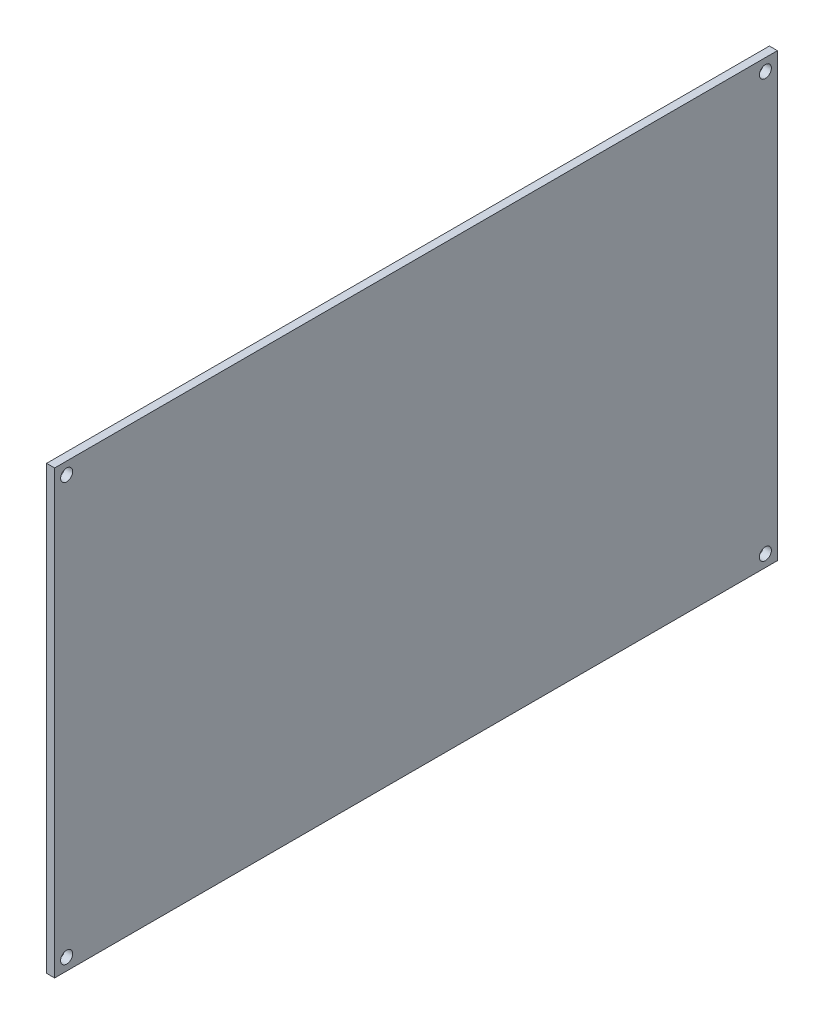
ISO-10303-21;
HEADER;
FILE_DESCRIPTION(('STEP AP214'),'2;1');
FILE_NAME('part.step','',(''),(''),'','','');
FILE_SCHEMA(('AUTOMOTIVE_DESIGN { 1 0 10303 214 1 1 1 1 }'));
ENDSEC;
DATA;
#1=APPLICATION_CONTEXT('core data for automotive mechanical design processes');
#2=APPLICATION_PROTOCOL_DEFINITION('international standard','automotive_design',2000,#1);
#3=PRODUCT_CONTEXT('',#1,'mechanical');
#4=PRODUCT('Part','Part','',(#3));
#5=PRODUCT_RELATED_PRODUCT_CATEGORY('part','',(#4));
#6=PRODUCT_DEFINITION_FORMATION('','',#4);
#7=PRODUCT_DEFINITION_CONTEXT('part definition',#1,'design');
#8=PRODUCT_DEFINITION('design','',#6,#7);
#9=PRODUCT_DEFINITION_SHAPE('','',#8);
#10=(LENGTH_UNIT() NAMED_UNIT(*) SI_UNIT(.MILLI.,.METRE.));
#11=(NAMED_UNIT(*) PLANE_ANGLE_UNIT() SI_UNIT($,.RADIAN.));
#12=(NAMED_UNIT(*) SI_UNIT($,.STERADIAN.) SOLID_ANGLE_UNIT());
#13=UNCERTAINTY_MEASURE_WITH_UNIT(LENGTH_MEASURE(1.E-05),#10,'distance_accuracy_value','');
#14=(GEOMETRIC_REPRESENTATION_CONTEXT(3) GLOBAL_UNCERTAINTY_ASSIGNED_CONTEXT((#13)) GLOBAL_UNIT_ASSIGNED_CONTEXT((#10,
#11,#12)) REPRESENTATION_CONTEXT('',''));
#15=CARTESIAN_POINT('',(0.,0.,0.));
#16=DIRECTION('',(0.,0.,1.));
#17=DIRECTION('',(1.,0.,0.));
#18=AXIS2_PLACEMENT_3D('',#15,#16,#17);
#19=CARTESIAN_POINT('',(2.,0.,0.));
#20=DIRECTION('',(0.,0.,-1.));
#21=DIRECTION('',(-1.,0.,0.));
#22=AXIS2_PLACEMENT_3D('',#19,#20,#21);
#23=PLANE('',#22);
#24=DIRECTION('',(0.,-1.,0.));
#25=VECTOR('',#24,1.);
#26=CARTESIAN_POINT('',(0.,0.,0.));
#27=LINE('',#26,#25);
#28=CARTESIAN_POINT('',(0.,110.,0.));
#29=VERTEX_POINT('',#28);
#30=CARTESIAN_POINT('',(0.,0.,0.));
#31=VERTEX_POINT('',#30);
#32=EDGE_CURVE('E99',#29,#31,#27,.T.);
#33=ORIENTED_EDGE('',*,*,#32,.T.);
#34=DIRECTION('',(-1.,0.,0.));
#35=VECTOR('',#34,1.);
#36=CARTESIAN_POINT('',(2.,0.,0.));
#37=LINE('',#36,#35);
#38=CARTESIAN_POINT('',(2.,0.,0.));
#39=VERTEX_POINT('',#38);
#40=EDGE_CURVE('E11',#39,#31,#37,.T.);
#41=ORIENTED_EDGE('',*,*,#40,.F.);
#42=DIRECTION('',(0.,-1.,0.));
#43=VECTOR('',#42,1.);
#44=CARTESIAN_POINT('',(2.,0.,0.));
#45=LINE('',#44,#43);
#46=CARTESIAN_POINT('',(2.,110.,0.));
#47=VERTEX_POINT('',#46);
#48=EDGE_CURVE('E86',#47,#39,#45,.T.);
#49=ORIENTED_EDGE('',*,*,#48,.F.);
#50=DIRECTION('',(-1.,0.,0.));
#51=VECTOR('',#50,1.);
#52=CARTESIAN_POINT('',(2.,110.,0.));
#53=LINE('',#52,#51);
#54=EDGE_CURVE('E95',#47,#29,#53,.T.);
#55=ORIENTED_EDGE('',*,*,#54,.T.);
#56=EDGE_LOOP('',(#33,#41,#49,#55));
#57=FACE_BOUND('',#56,.T.);
#58=ADVANCED_FACE('F33',(#57),#23,.F.);
#59=CARTESIAN_POINT('',(2.,0.,0.));
#60=DIRECTION('',(0.,1.,0.));
#61=DIRECTION('',(0.,0.,1.));
#62=AXIS2_PLACEMENT_3D('',#59,#60,#61);
#63=PLANE('',#62);
#64=DIRECTION('',(0.,0.,-1.));
#65=VECTOR('',#64,1.);
#66=CARTESIAN_POINT('',(0.,0.,0.));
#67=LINE('',#66,#65);
#68=CARTESIAN_POINT('',(0.,0.,-180.));
#69=VERTEX_POINT('',#68);
#70=EDGE_CURVE('E90',#31,#69,#67,.T.);
#71=ORIENTED_EDGE('',*,*,#70,.T.);
#72=DIRECTION('',(-1.,0.,0.));
#73=VECTOR('',#72,1.);
#74=CARTESIAN_POINT('',(2.,0.,-180.));
#75=LINE('',#74,#73);
#76=CARTESIAN_POINT('',(2.,0.,-180.));
#77=VERTEX_POINT('',#76);
#78=EDGE_CURVE('E42',#77,#69,#75,.T.);
#79=ORIENTED_EDGE('',*,*,#78,.F.);
#80=DIRECTION('',(0.,0.,-1.));
#81=VECTOR('',#80,1.);
#82=CARTESIAN_POINT('',(2.,0.,0.));
#83=LINE('',#82,#81);
#84=EDGE_CURVE('E81',#39,#77,#83,.T.);
#85=ORIENTED_EDGE('',*,*,#84,.F.);
#86=ORIENTED_EDGE('',*,*,#40,.T.);
#87=EDGE_LOOP('',(#71,#79,#85,#86));
#88=FACE_BOUND('',#87,.T.);
#89=ADVANCED_FACE('F89',(#88),#63,.F.);
#90=CARTESIAN_POINT('',(2.,0.,-180.));
#91=DIRECTION('',(0.,0.,1.));
#92=DIRECTION('',(1.,0.,0.));
#93=AXIS2_PLACEMENT_3D('',#90,#91,#92);
#94=PLANE('',#93);
#95=DIRECTION('',(0.,1.,0.));
#96=VECTOR('',#95,1.);
#97=CARTESIAN_POINT('',(0.,0.,-180.));
#98=LINE('',#97,#96);
#99=CARTESIAN_POINT('',(0.,110.,-180.));
#100=VERTEX_POINT('',#99);
#101=EDGE_CURVE('E68',#69,#100,#98,.T.);
#102=ORIENTED_EDGE('',*,*,#101,.T.);
#103=DIRECTION('',(-1.,0.,0.));
#104=VECTOR('',#103,1.);
#105=CARTESIAN_POINT('',(2.,110.,-180.));
#106=LINE('',#105,#104);
#107=CARTESIAN_POINT('',(2.,110.,-180.));
#108=VERTEX_POINT('',#107);
#109=EDGE_CURVE('E91',#108,#100,#106,.T.);
#110=ORIENTED_EDGE('',*,*,#109,.F.);
#111=DIRECTION('',(0.,1.,0.));
#112=VECTOR('',#111,1.);
#113=CARTESIAN_POINT('',(2.,0.,-180.));
#114=LINE('',#113,#112);
#115=EDGE_CURVE('E84',#77,#108,#114,.T.);
#116=ORIENTED_EDGE('',*,*,#115,.F.);
#117=ORIENTED_EDGE('',*,*,#78,.T.);
#118=EDGE_LOOP('',(#102,#110,#116,#117));
#119=FACE_BOUND('',#118,.T.);
#120=ADVANCED_FACE('F93',(#119),#94,.F.);
#121=CARTESIAN_POINT('',(2.,110.,0.));
#122=DIRECTION('',(0.,-1.,0.));
#123=DIRECTION('',(0.,0.,-1.));
#124=AXIS2_PLACEMENT_3D('',#121,#122,#123);
#125=PLANE('',#124);
#126=DIRECTION('',(0.,0.,1.));
#127=VECTOR('',#126,1.);
#128=CARTESIAN_POINT('',(0.,110.,0.));
#129=LINE('',#128,#127);
#130=EDGE_CURVE('E74',#100,#29,#129,.T.);
#131=ORIENTED_EDGE('',*,*,#130,.T.);
#132=ORIENTED_EDGE('',*,*,#54,.F.);
#133=DIRECTION('',(0.,0.,1.));
#134=VECTOR('',#133,1.);
#135=CARTESIAN_POINT('',(2.,110.,0.));
#136=LINE('',#135,#134);
#137=EDGE_CURVE('E51',#108,#47,#136,.T.);
#138=ORIENTED_EDGE('',*,*,#137,.F.);
#139=ORIENTED_EDGE('',*,*,#109,.T.);
#140=EDGE_LOOP('',(#131,#132,#138,#139));
#141=FACE_BOUND('',#140,.T.);
#142=ADVANCED_FACE('F140',(#141),#125,.F.);
#143=CARTESIAN_POINT('',(2.,0.,0.));
#144=DIRECTION('',(-1.,0.,0.));
#145=DIRECTION('',(0.,0.,1.));
#146=AXIS2_PLACEMENT_3D('',#143,#144,#145);
#147=PLANE('',#146);
#148=CARTESIAN_POINT('',(2.,107.,-177.));
#149=DIRECTION('',(1.,0.,0.));
#150=DIRECTION('',(0.,0.,-1.));
#151=AXIS2_PLACEMENT_3D('',#148,#149,#150);
#152=CIRCLE('',#151,1.5);
#153=CARTESIAN_POINT('',(2.,107.,-178.5));
#154=VERTEX_POINT('',#153);
#155=EDGE_CURVE('E114',#154,#154,#152,.T.);
#156=ORIENTED_EDGE('',*,*,#155,.F.);
#157=EDGE_LOOP('',(#156));
#158=FACE_BOUND('',#157,.T.);
#159=CARTESIAN_POINT('',(2.,3.,-177.));
#160=DIRECTION('',(1.,0.,0.));
#161=DIRECTION('',(0.,0.,-1.));
#162=AXIS2_PLACEMENT_3D('',#159,#160,#161);
#163=CIRCLE('',#162,1.5);
#164=CARTESIAN_POINT('',(2.,3.,-178.5));
#165=VERTEX_POINT('',#164);
#166=EDGE_CURVE('E129',#165,#165,#163,.T.);
#167=ORIENTED_EDGE('',*,*,#166,.F.);
#168=EDGE_LOOP('',(#167));
#169=FACE_BOUND('',#168,.T.);
#170=CARTESIAN_POINT('',(2.,3.,-3.));
#171=DIRECTION('',(1.,0.,0.));
#172=DIRECTION('',(0.,0.,-1.));
#173=AXIS2_PLACEMENT_3D('',#170,#171,#172);
#174=CIRCLE('',#173,1.5);
#175=CARTESIAN_POINT('',(2.,3.,-4.5));
#176=VERTEX_POINT('',#175);
#177=EDGE_CURVE('E126',#176,#176,#174,.T.);
#178=ORIENTED_EDGE('',*,*,#177,.F.);
#179=EDGE_LOOP('',(#178));
#180=FACE_BOUND('',#179,.T.);
#181=CARTESIAN_POINT('',(2.,107.,-3.));
#182=DIRECTION('',(1.,0.,0.));
#183=DIRECTION('',(0.,0.,-1.));
#184=AXIS2_PLACEMENT_3D('',#181,#182,#183);
#185=CIRCLE('',#184,1.5);
#186=CARTESIAN_POINT('',(2.,107.,-4.5));
#187=VERTEX_POINT('',#186);
#188=EDGE_CURVE('E110',#187,#187,#185,.T.);
#189=ORIENTED_EDGE('',*,*,#188,.F.);
#190=EDGE_LOOP('',(#189));
#191=FACE_BOUND('',#190,.T.);
#192=ORIENTED_EDGE('',*,*,#48,.T.);
#193=ORIENTED_EDGE('',*,*,#84,.T.);
#194=ORIENTED_EDGE('',*,*,#115,.T.);
#195=ORIENTED_EDGE('',*,*,#137,.T.);
#196=EDGE_LOOP('',(#192,#193,#194,#195));
#197=FACE_BOUND('',#196,.T.);
#198=ADVANCED_FACE('F82',(#158,#169,#180,#191,#197),#147,.F.);
#199=CARTESIAN_POINT('',(0.,0.,0.));
#200=DIRECTION('',(-1.,0.,0.));
#201=DIRECTION('',(0.,0.,1.));
#202=AXIS2_PLACEMENT_3D('',#199,#200,#201);
#203=PLANE('',#202);
#204=CARTESIAN_POINT('',(0.,107.,-177.));
#205=DIRECTION('',(-1.,0.,0.));
#206=DIRECTION('',(0.,0.,1.));
#207=AXIS2_PLACEMENT_3D('',#204,#205,#206);
#208=CIRCLE('',#207,1.5);
#209=CARTESIAN_POINT('',(0.,107.,-175.5));
#210=VERTEX_POINT('',#209);
#211=EDGE_CURVE('E36',#210,#210,#208,.T.);
#212=ORIENTED_EDGE('',*,*,#211,.F.);
#213=EDGE_LOOP('',(#212));
#214=FACE_BOUND('',#213,.T.);
#215=CARTESIAN_POINT('',(0.,3.,-177.));
#216=DIRECTION('',(-1.,0.,0.));
#217=DIRECTION('',(0.,0.,1.));
#218=AXIS2_PLACEMENT_3D('',#215,#216,#217);
#219=CIRCLE('',#218,1.5);
#220=CARTESIAN_POINT('',(0.,3.,-175.5));
#221=VERTEX_POINT('',#220);
#222=EDGE_CURVE('E113',#221,#221,#219,.T.);
#223=ORIENTED_EDGE('',*,*,#222,.F.);
#224=EDGE_LOOP('',(#223));
#225=FACE_BOUND('',#224,.T.);
#226=CARTESIAN_POINT('',(0.,3.,-3.));
#227=DIRECTION('',(-1.,0.,0.));
#228=DIRECTION('',(0.,0.,1.));
#229=AXIS2_PLACEMENT_3D('',#226,#227,#228);
#230=CIRCLE('',#229,1.5);
#231=CARTESIAN_POINT('',(0.,3.,-1.5));
#232=VERTEX_POINT('',#231);
#233=EDGE_CURVE('E111',#232,#232,#230,.T.);
#234=ORIENTED_EDGE('',*,*,#233,.F.);
#235=EDGE_LOOP('',(#234));
#236=FACE_BOUND('',#235,.T.);
#237=CARTESIAN_POINT('',(0.,107.,-3.));
#238=DIRECTION('',(-1.,0.,0.));
#239=DIRECTION('',(0.,0.,1.));
#240=AXIS2_PLACEMENT_3D('',#237,#238,#239);
#241=CIRCLE('',#240,1.5);
#242=CARTESIAN_POINT('',(0.,107.,-1.5));
#243=VERTEX_POINT('',#242);
#244=EDGE_CURVE('E102',#243,#243,#241,.T.);
#245=ORIENTED_EDGE('',*,*,#244,.F.);
#246=EDGE_LOOP('',(#245));
#247=FACE_BOUND('',#246,.T.);
#248=ORIENTED_EDGE('',*,*,#32,.F.);
#249=ORIENTED_EDGE('',*,*,#130,.F.);
#250=ORIENTED_EDGE('',*,*,#101,.F.);
#251=ORIENTED_EDGE('',*,*,#70,.F.);
#252=EDGE_LOOP('',(#248,#249,#250,#251));
#253=FACE_BOUND('',#252,.T.);
#254=ADVANCED_FACE('F139',(#214,#225,#236,#247,#253),#203,.T.);
#255=CARTESIAN_POINT('',(-1.,107.,-3.));
#256=DIRECTION('',(1.,0.,0.));
#257=DIRECTION('',(0.,0.,-1.));
#258=AXIS2_PLACEMENT_3D('',#255,#256,#257);
#259=CYLINDRICAL_SURFACE('',#258,1.5);
#260=ORIENTED_EDGE('',*,*,#244,.T.);
#261=EDGE_LOOP('',(#260));
#262=FACE_BOUND('',#261,.T.);
#263=ORIENTED_EDGE('',*,*,#188,.T.);
#264=EDGE_LOOP('',(#263));
#265=FACE_BOUND('',#264,.T.);
#266=ADVANCED_FACE('F150',(#262,#265),#259,.F.);
#267=CARTESIAN_POINT('',(-1.,3.,-3.));
#268=DIRECTION('',(1.,0.,0.));
#269=DIRECTION('',(0.,0.,-1.));
#270=AXIS2_PLACEMENT_3D('',#267,#268,#269);
#271=CYLINDRICAL_SURFACE('',#270,1.5);
#272=ORIENTED_EDGE('',*,*,#233,.T.);
#273=EDGE_LOOP('',(#272));
#274=FACE_BOUND('',#273,.T.);
#275=ORIENTED_EDGE('',*,*,#177,.T.);
#276=EDGE_LOOP('',(#275));
#277=FACE_BOUND('',#276,.T.);
#278=ADVANCED_FACE('F147',(#274,#277),#271,.F.);
#279=CARTESIAN_POINT('',(-1.,3.,-177.));
#280=DIRECTION('',(1.,0.,0.));
#281=DIRECTION('',(0.,0.,-1.));
#282=AXIS2_PLACEMENT_3D('',#279,#280,#281);
#283=CYLINDRICAL_SURFACE('',#282,1.5);
#284=ORIENTED_EDGE('',*,*,#222,.T.);
#285=EDGE_LOOP('',(#284));
#286=FACE_BOUND('',#285,.T.);
#287=ORIENTED_EDGE('',*,*,#166,.T.);
#288=EDGE_LOOP('',(#287));
#289=FACE_BOUND('',#288,.T.);
#290=ADVANCED_FACE('F149',(#286,#289),#283,.F.);
#291=CARTESIAN_POINT('',(-1.,107.,-177.));
#292=DIRECTION('',(1.,0.,0.));
#293=DIRECTION('',(0.,0.,-1.));
#294=AXIS2_PLACEMENT_3D('',#291,#292,#293);
#295=CYLINDRICAL_SURFACE('',#294,1.5);
#296=ORIENTED_EDGE('',*,*,#211,.T.);
#297=EDGE_LOOP('',(#296));
#298=FACE_BOUND('',#297,.T.);
#299=ORIENTED_EDGE('',*,*,#155,.T.);
#300=EDGE_LOOP('',(#299));
#301=FACE_BOUND('',#300,.T.);
#302=ADVANCED_FACE('F135',(#298,#301),#295,.F.);
#303=CLOSED_SHELL('',(#58,#89,#120,#142,#198,#254,#266,#278,#290,#302));
#304=MANIFOLD_SOLID_BREP('B2',#303);
#305=ADVANCED_BREP_SHAPE_REPRESENTATION('',(#18,#304),#14);
#306=SHAPE_DEFINITION_REPRESENTATION(#9,#305);
ENDSEC;
END-ISO-10303-21;
